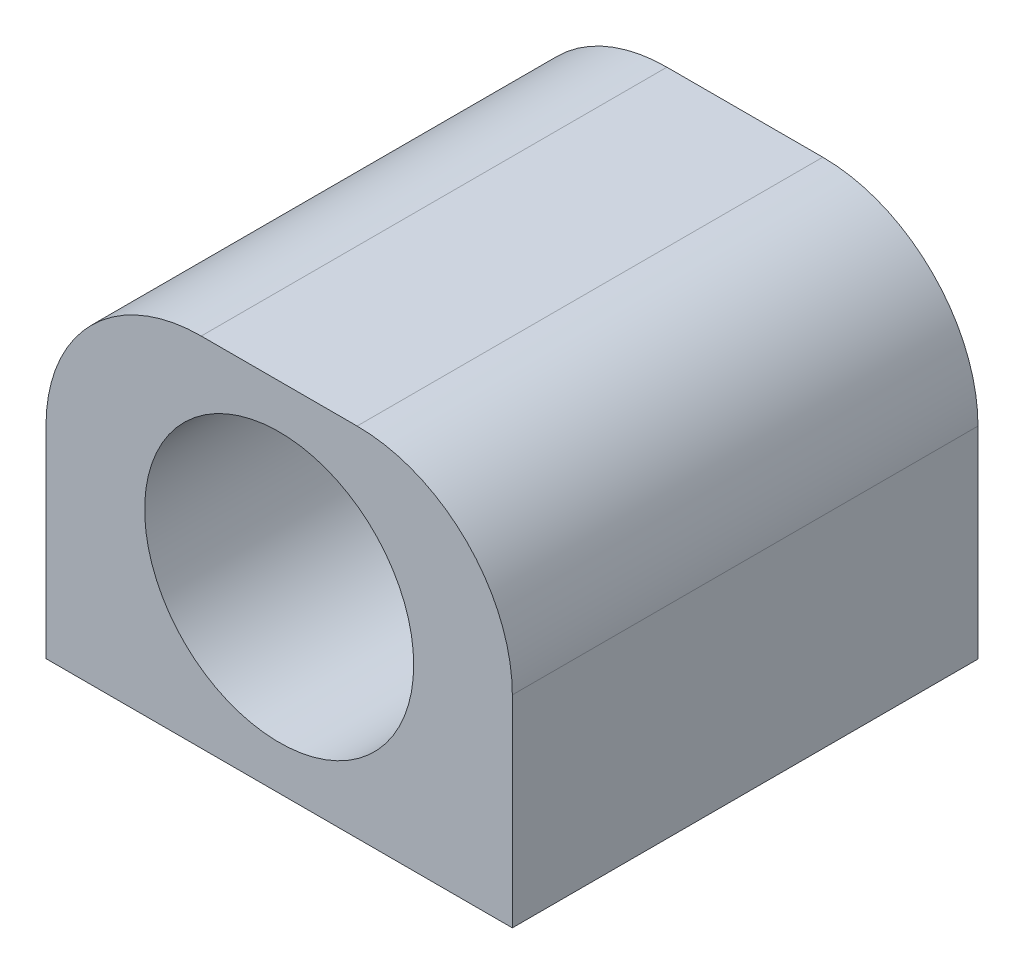
ISO-10303-21;
HEADER;
FILE_DESCRIPTION(('STEP AP214'),'2;1');
FILE_NAME('part.step','',(''),(''),'','','');
FILE_SCHEMA(('AUTOMOTIVE_DESIGN { 1 0 10303 214 1 1 1 1 }'));
ENDSEC;
DATA;
#1=APPLICATION_CONTEXT('core data for automotive mechanical design processes');
#2=APPLICATION_PROTOCOL_DEFINITION('international standard','automotive_design',2000,#1);
#3=PRODUCT_CONTEXT('',#1,'mechanical');
#4=PRODUCT('Part','Part','',(#3));
#5=PRODUCT_RELATED_PRODUCT_CATEGORY('part','',(#4));
#6=PRODUCT_DEFINITION_FORMATION('','',#4);
#7=PRODUCT_DEFINITION_CONTEXT('part definition',#1,'design');
#8=PRODUCT_DEFINITION('design','',#6,#7);
#9=PRODUCT_DEFINITION_SHAPE('','',#8);
#10=(LENGTH_UNIT() NAMED_UNIT(*) SI_UNIT(.MILLI.,.METRE.));
#11=(NAMED_UNIT(*) PLANE_ANGLE_UNIT() SI_UNIT($,.RADIAN.));
#12=(NAMED_UNIT(*) SI_UNIT($,.STERADIAN.) SOLID_ANGLE_UNIT());
#13=UNCERTAINTY_MEASURE_WITH_UNIT(LENGTH_MEASURE(1.E-05),#10,'distance_accuracy_value','');
#14=(GEOMETRIC_REPRESENTATION_CONTEXT(3) GLOBAL_UNCERTAINTY_ASSIGNED_CONTEXT((#13)) GLOBAL_UNIT_ASSIGNED_CONTEXT((#10,
#11,#12)) REPRESENTATION_CONTEXT('',''));
#15=CARTESIAN_POINT('',(0.,0.,0.));
#16=DIRECTION('',(0.,0.,1.));
#17=DIRECTION('',(1.,0.,0.));
#18=AXIS2_PLACEMENT_3D('',#15,#16,#17);
#19=CARTESIAN_POINT('',(27.4782319218155,12.9999999999999,-60.));
#20=DIRECTION('',(-1.,0.,0.));
#21=DIRECTION('',(0.,0.,1.));
#22=AXIS2_PLACEMENT_3D('',#19,#20,#21);
#23=PLANE('',#22);
#24=DIRECTION('',(0.,-1.,0.));
#25=VECTOR('',#24,1.);
#26=CARTESIAN_POINT('',(27.4782319218155,12.9999999999999,-30.));
#27=LINE('',#26,#25);
#28=CARTESIAN_POINT('',(27.4782319218155,12.9999999999999,-30.));
#29=VERTEX_POINT('',#28);
#30=CARTESIAN_POINT('',(27.4782319218155,0.,-30.));
#31=VERTEX_POINT('',#30);
#32=EDGE_CURVE('E126',#29,#31,#27,.T.);
#33=ORIENTED_EDGE('',*,*,#32,.F.);
#34=DIRECTION('',(0.,0.,1.));
#35=VECTOR('',#34,1.);
#36=CARTESIAN_POINT('',(27.4782319218155,12.9999999999999,-60.));
#37=LINE('',#36,#35);
#38=CARTESIAN_POINT('',(27.4782319218155,12.9999999999999,-60.));
#39=VERTEX_POINT('',#38);
#40=EDGE_CURVE('E11',#39,#29,#37,.T.);
#41=ORIENTED_EDGE('',*,*,#40,.F.);
#42=DIRECTION('',(0.,-1.,0.));
#43=VECTOR('',#42,1.);
#44=CARTESIAN_POINT('',(27.4782319218155,12.9999999999999,-60.));
#45=LINE('',#44,#43);
#46=CARTESIAN_POINT('',(27.4782319218155,0.,-60.));
#47=VERTEX_POINT('',#46);
#48=EDGE_CURVE('E141',#39,#47,#45,.T.);
#49=ORIENTED_EDGE('',*,*,#48,.T.);
#50=DIRECTION('',(0.,0.,1.));
#51=VECTOR('',#50,1.);
#52=CARTESIAN_POINT('',(27.4782319218155,0.,-60.));
#53=LINE('',#52,#51);
#54=EDGE_CURVE('E44',#47,#31,#53,.T.);
#55=ORIENTED_EDGE('',*,*,#54,.T.);
#56=EDGE_LOOP('',(#33,#41,#49,#55));
#57=FACE_BOUND('',#56,.T.);
#58=ADVANCED_FACE('F41',(#57),#23,.T.);
#59=CARTESIAN_POINT('',(37.4782319218155,13.,-60.));
#60=DIRECTION('',(0.,0.,1.));
#61=DIRECTION('',(1.,0.,0.));
#62=AXIS2_PLACEMENT_3D('',#59,#60,#61);
#63=CYLINDRICAL_SURFACE('',#62,10.);
#64=CARTESIAN_POINT('',(37.4782319218155,13.,-30.));
#65=DIRECTION('',(0.,0.,1.));
#66=DIRECTION('',(1.,0.,0.));
#67=AXIS2_PLACEMENT_3D('',#64,#65,#66);
#68=CIRCLE('',#67,10.);
#69=CARTESIAN_POINT('',(37.4782319218156,23.,-30.));
#70=VERTEX_POINT('',#69);
#71=EDGE_CURVE('E139',#70,#29,#68,.T.);
#72=ORIENTED_EDGE('',*,*,#71,.F.);
#73=DIRECTION('',(0.,0.,1.));
#74=VECTOR('',#73,1.);
#75=CARTESIAN_POINT('',(37.4782319218156,23.,-60.));
#76=LINE('',#75,#74);
#77=CARTESIAN_POINT('',(37.4782319218156,23.,-60.));
#78=VERTEX_POINT('',#77);
#79=EDGE_CURVE('E50',#78,#70,#76,.T.);
#80=ORIENTED_EDGE('',*,*,#79,.F.);
#81=CARTESIAN_POINT('',(37.4782319218155,13.,-60.));
#82=DIRECTION('',(0.,0.,1.));
#83=DIRECTION('',(1.,0.,0.));
#84=AXIS2_PLACEMENT_3D('',#81,#82,#83);
#85=CIRCLE('',#84,10.);
#86=EDGE_CURVE('E116',#78,#39,#85,.T.);
#87=ORIENTED_EDGE('',*,*,#86,.T.);
#88=ORIENTED_EDGE('',*,*,#40,.T.);
#89=EDGE_LOOP('',(#72,#80,#87,#88));
#90=FACE_BOUND('',#89,.T.);
#91=ADVANCED_FACE('F149',(#90),#63,.T.);
#92=CARTESIAN_POINT('',(47.5217680781844,23.,-60.));
#93=DIRECTION('',(0.,1.,0.));
#94=DIRECTION('',(0.,0.,1.));
#95=AXIS2_PLACEMENT_3D('',#92,#93,#94);
#96=PLANE('',#95);
#97=DIRECTION('',(-1.,0.,0.));
#98=VECTOR('',#97,1.);
#99=CARTESIAN_POINT('',(47.5217680781844,23.,-30.));
#100=LINE('',#99,#98);
#101=CARTESIAN_POINT('',(47.5217680781844,23.,-30.));
#102=VERTEX_POINT('',#101);
#103=EDGE_CURVE('E103',#102,#70,#100,.T.);
#104=ORIENTED_EDGE('',*,*,#103,.F.);
#105=DIRECTION('',(0.,0.,1.));
#106=VECTOR('',#105,1.);
#107=CARTESIAN_POINT('',(47.5217680781844,23.,-60.));
#108=LINE('',#107,#106);
#109=CARTESIAN_POINT('',(47.5217680781844,23.,-60.));
#110=VERTEX_POINT('',#109);
#111=EDGE_CURVE('E98',#110,#102,#108,.T.);
#112=ORIENTED_EDGE('',*,*,#111,.F.);
#113=DIRECTION('',(-1.,0.,0.));
#114=VECTOR('',#113,1.);
#115=CARTESIAN_POINT('',(47.5217680781844,23.,-60.));
#116=LINE('',#115,#114);
#117=EDGE_CURVE('E101',#110,#78,#116,.T.);
#118=ORIENTED_EDGE('',*,*,#117,.T.);
#119=ORIENTED_EDGE('',*,*,#79,.T.);
#120=EDGE_LOOP('',(#104,#112,#118,#119));
#121=FACE_BOUND('',#120,.T.);
#122=ADVANCED_FACE('F100',(#121),#96,.T.);
#123=CARTESIAN_POINT('',(47.5217680781845,13.,-60.));
#124=DIRECTION('',(0.,0.,1.));
#125=DIRECTION('',(1.,0.,0.));
#126=AXIS2_PLACEMENT_3D('',#123,#124,#125);
#127=CYLINDRICAL_SURFACE('',#126,10.);
#128=CARTESIAN_POINT('',(47.5217680781845,13.,-30.));
#129=DIRECTION('',(0.,0.,1.));
#130=DIRECTION('',(-1.,0.,0.));
#131=AXIS2_PLACEMENT_3D('',#128,#129,#130);
#132=CIRCLE('',#131,10.);
#133=CARTESIAN_POINT('',(57.5217680781845,12.9999999999999,-30.));
#134=VERTEX_POINT('',#133);
#135=EDGE_CURVE('E136',#134,#102,#132,.T.);
#136=ORIENTED_EDGE('',*,*,#135,.F.);
#137=DIRECTION('',(0.,0.,1.));
#138=VECTOR('',#137,1.);
#139=CARTESIAN_POINT('',(57.5217680781845,12.9999999999999,-60.));
#140=LINE('',#139,#138);
#141=CARTESIAN_POINT('',(57.5217680781845,12.9999999999999,-60.));
#142=VERTEX_POINT('',#141);
#143=EDGE_CURVE('E108',#142,#134,#140,.T.);
#144=ORIENTED_EDGE('',*,*,#143,.F.);
#145=CARTESIAN_POINT('',(47.5217680781845,13.,-60.));
#146=DIRECTION('',(0.,0.,1.));
#147=DIRECTION('',(-1.,0.,0.));
#148=AXIS2_PLACEMENT_3D('',#145,#146,#147);
#149=CIRCLE('',#148,10.);
#150=EDGE_CURVE('E114',#142,#110,#149,.T.);
#151=ORIENTED_EDGE('',*,*,#150,.T.);
#152=ORIENTED_EDGE('',*,*,#111,.T.);
#153=EDGE_LOOP('',(#136,#144,#151,#152));
#154=FACE_BOUND('',#153,.T.);
#155=ADVANCED_FACE('F118',(#154),#127,.T.);
#156=CARTESIAN_POINT('',(57.5217680781845,12.9999999999999,-60.));
#157=DIRECTION('',(1.,0.,0.));
#158=DIRECTION('',(0.,0.,-1.));
#159=AXIS2_PLACEMENT_3D('',#156,#157,#158);
#160=PLANE('',#159);
#161=DIRECTION('',(0.,1.,0.));
#162=VECTOR('',#161,1.);
#163=CARTESIAN_POINT('',(57.5217680781845,12.9999999999999,-30.));
#164=LINE('',#163,#162);
#165=CARTESIAN_POINT('',(57.5217680781845,0.,-30.));
#166=VERTEX_POINT('',#165);
#167=EDGE_CURVE('E133',#166,#134,#164,.T.);
#168=ORIENTED_EDGE('',*,*,#167,.F.);
#169=DIRECTION('',(0.,0.,1.));
#170=VECTOR('',#169,1.);
#171=CARTESIAN_POINT('',(57.5217680781845,0.,-60.));
#172=LINE('',#171,#170);
#173=CARTESIAN_POINT('',(57.5217680781845,0.,-60.));
#174=VERTEX_POINT('',#173);
#175=EDGE_CURVE('E144',#174,#166,#172,.T.);
#176=ORIENTED_EDGE('',*,*,#175,.F.);
#177=DIRECTION('',(0.,1.,0.));
#178=VECTOR('',#177,1.);
#179=CARTESIAN_POINT('',(57.5217680781845,12.9999999999999,-60.));
#180=LINE('',#179,#178);
#181=EDGE_CURVE('E119',#174,#142,#180,.T.);
#182=ORIENTED_EDGE('',*,*,#181,.T.);
#183=ORIENTED_EDGE('',*,*,#143,.T.);
#184=EDGE_LOOP('',(#168,#176,#182,#183));
#185=FACE_BOUND('',#184,.T.);
#186=ADVANCED_FACE('F162',(#185),#160,.T.);
#187=CARTESIAN_POINT('',(57.5217680781845,0.,-60.));
#188=DIRECTION('',(0.,-1.,0.));
#189=DIRECTION('',(0.,0.,-1.));
#190=AXIS2_PLACEMENT_3D('',#187,#188,#189);
#191=PLANE('',#190);
#192=DIRECTION('',(1.,0.,0.));
#193=VECTOR('',#192,1.);
#194=CARTESIAN_POINT('',(57.5217680781845,0.,-30.));
#195=LINE('',#194,#193);
#196=EDGE_CURVE('E129',#31,#166,#195,.T.);
#197=ORIENTED_EDGE('',*,*,#196,.F.);
#198=ORIENTED_EDGE('',*,*,#54,.F.);
#199=DIRECTION('',(1.,0.,0.));
#200=VECTOR('',#199,1.);
#201=CARTESIAN_POINT('',(57.5217680781845,0.,-60.));
#202=LINE('',#201,#200);
#203=EDGE_CURVE('E121',#47,#174,#202,.T.);
#204=ORIENTED_EDGE('',*,*,#203,.T.);
#205=ORIENTED_EDGE('',*,*,#175,.T.);
#206=EDGE_LOOP('',(#197,#198,#204,#205));
#207=FACE_BOUND('',#206,.T.);
#208=ADVANCED_FACE('F146',(#207),#191,.T.);
#209=CARTESIAN_POINT('',(47.5217680781845,13.,-60.));
#210=DIRECTION('',(0.,0.,-1.));
#211=DIRECTION('',(-1.,0.,0.));
#212=AXIS2_PLACEMENT_3D('',#209,#210,#211);
#213=PLANE('',#212);
#214=CARTESIAN_POINT('',(42.5,11.5,-60.));
#215=DIRECTION('',(0.,0.,1.));
#216=DIRECTION('',(1.,0.,0.));
#217=AXIS2_PLACEMENT_3D('',#214,#215,#216);
#218=CIRCLE('',#217,8.66666666666667);
#219=CARTESIAN_POINT('',(51.1666666666667,11.5,-60.));
#220=VERTEX_POINT('',#219);
#221=EDGE_CURVE('E130',#220,#220,#218,.T.);
#222=ORIENTED_EDGE('',*,*,#221,.T.);
#223=EDGE_LOOP('',(#222));
#224=FACE_BOUND('',#223,.T.);
#225=ORIENTED_EDGE('',*,*,#48,.F.);
#226=ORIENTED_EDGE('',*,*,#86,.F.);
#227=ORIENTED_EDGE('',*,*,#117,.F.);
#228=ORIENTED_EDGE('',*,*,#150,.F.);
#229=ORIENTED_EDGE('',*,*,#181,.F.);
#230=ORIENTED_EDGE('',*,*,#203,.F.);
#231=EDGE_LOOP('',(#225,#226,#227,#228,#229,#230));
#232=FACE_BOUND('',#231,.T.);
#233=ADVANCED_FACE('F112',(#224,#232),#213,.T.);
#234=CARTESIAN_POINT('',(47.5217680781845,13.,-30.));
#235=DIRECTION('',(0.,0.,-1.));
#236=DIRECTION('',(-1.,0.,0.));
#237=AXIS2_PLACEMENT_3D('',#234,#235,#236);
#238=PLANE('',#237);
#239=CARTESIAN_POINT('',(42.5,11.5,-30.));
#240=DIRECTION('',(0.,0.,1.));
#241=DIRECTION('',(1.,0.,0.));
#242=AXIS2_PLACEMENT_3D('',#239,#240,#241);
#243=CIRCLE('',#242,8.66666666666667);
#244=CARTESIAN_POINT('',(51.1666666666667,11.5,-30.));
#245=VERTEX_POINT('',#244);
#246=EDGE_CURVE('E185',#245,#245,#243,.T.);
#247=ORIENTED_EDGE('',*,*,#246,.F.);
#248=EDGE_LOOP('',(#247));
#249=FACE_BOUND('',#248,.T.);
#250=ORIENTED_EDGE('',*,*,#32,.T.);
#251=ORIENTED_EDGE('',*,*,#196,.T.);
#252=ORIENTED_EDGE('',*,*,#167,.T.);
#253=ORIENTED_EDGE('',*,*,#135,.T.);
#254=ORIENTED_EDGE('',*,*,#103,.T.);
#255=ORIENTED_EDGE('',*,*,#71,.T.);
#256=EDGE_LOOP('',(#250,#251,#252,#253,#254,#255));
#257=FACE_BOUND('',#256,.T.);
#258=ADVANCED_FACE('F148',(#249,#257),#238,.F.);
#259=CARTESIAN_POINT('',(42.5,11.5,-60.));
#260=DIRECTION('',(0.,0.,1.));
#261=DIRECTION('',(1.,0.,0.));
#262=AXIS2_PLACEMENT_3D('',#259,#260,#261);
#263=CYLINDRICAL_SURFACE('',#262,8.66666666666667);
#264=ORIENTED_EDGE('',*,*,#221,.F.);
#265=EDGE_LOOP('',(#264));
#266=FACE_BOUND('',#265,.T.);
#267=ORIENTED_EDGE('',*,*,#246,.T.);
#268=EDGE_LOOP('',(#267));
#269=FACE_BOUND('',#268,.T.);
#270=ADVANCED_FACE('F173',(#266,#269),#263,.F.);
#271=CLOSED_SHELL('',(#58,#91,#122,#155,#186,#208,#233,#258,#270));
#272=MANIFOLD_SOLID_BREP('B2',#271);
#273=ADVANCED_BREP_SHAPE_REPRESENTATION('',(#18,#272),#14);
#274=SHAPE_DEFINITION_REPRESENTATION(#9,#273);
ENDSEC;
END-ISO-10303-21;
